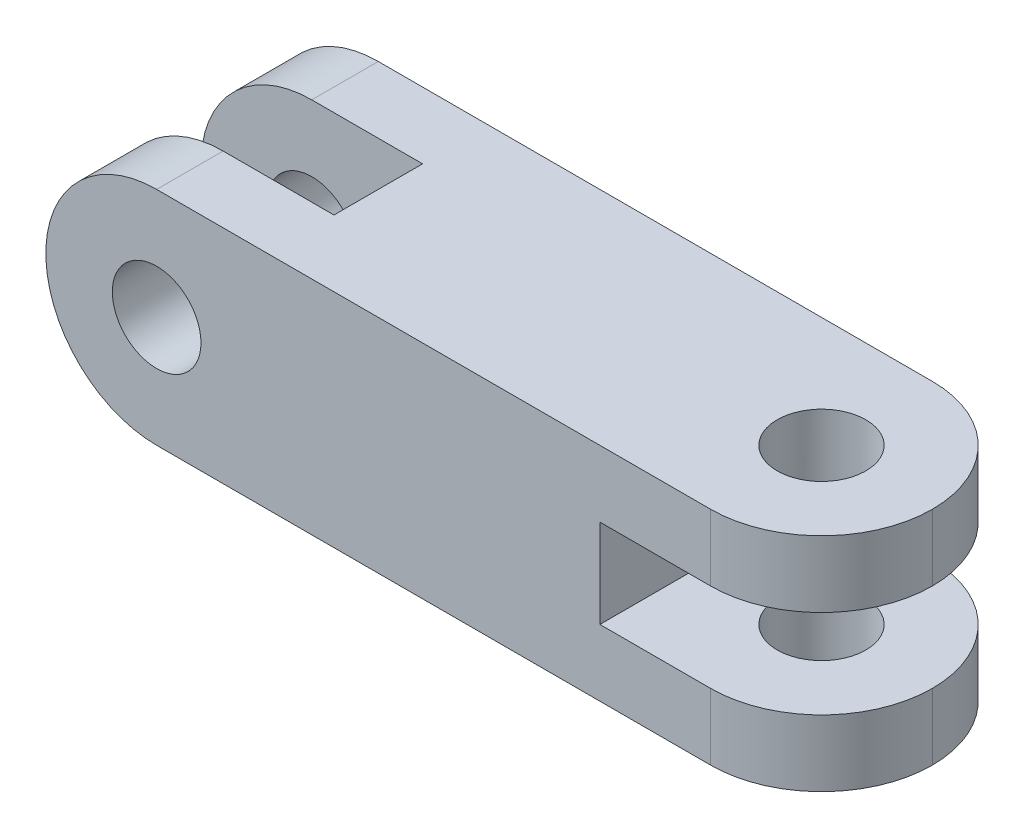
ISO-10303-21;
HEADER;
FILE_DESCRIPTION(('STEP AP214'),'2;1');
FILE_NAME('part.step','',(''),(''),'','','');
FILE_SCHEMA(('AUTOMOTIVE_DESIGN { 1 0 10303 214 1 1 1 1 }'));
ENDSEC;
DATA;
#1=APPLICATION_CONTEXT('core data for automotive mechanical design processes');
#2=APPLICATION_PROTOCOL_DEFINITION('international standard','automotive_design',2000,#1);
#3=PRODUCT_CONTEXT('',#1,'mechanical');
#4=PRODUCT('Part','Part','',(#3));
#5=PRODUCT_RELATED_PRODUCT_CATEGORY('part','',(#4));
#6=PRODUCT_DEFINITION_FORMATION('','',#4);
#7=PRODUCT_DEFINITION_CONTEXT('part definition',#1,'design');
#8=PRODUCT_DEFINITION('design','',#6,#7);
#9=PRODUCT_DEFINITION_SHAPE('','',#8);
#10=(LENGTH_UNIT() NAMED_UNIT(*) SI_UNIT(.MILLI.,.METRE.));
#11=(NAMED_UNIT(*) PLANE_ANGLE_UNIT() SI_UNIT($,.RADIAN.));
#12=(NAMED_UNIT(*) SI_UNIT($,.STERADIAN.) SOLID_ANGLE_UNIT());
#13=UNCERTAINTY_MEASURE_WITH_UNIT(LENGTH_MEASURE(1.E-05),#10,'distance_accuracy_value','');
#14=(GEOMETRIC_REPRESENTATION_CONTEXT(3) GLOBAL_UNCERTAINTY_ASSIGNED_CONTEXT((#13)) GLOBAL_UNIT_ASSIGNED_CONTEXT((#10,
#11,#12)) REPRESENTATION_CONTEXT('',''));
#15=CARTESIAN_POINT('',(0.,0.,0.));
#16=DIRECTION('',(0.,0.,1.));
#17=DIRECTION('',(1.,0.,0.));
#18=AXIS2_PLACEMENT_3D('',#15,#16,#17);
#19=CARTESIAN_POINT('',(-25.,0.,0.));
#20=DIRECTION('',(0.,-1.,0.));
#21=DIRECTION('',(0.,0.,-1.));
#22=AXIS2_PLACEMENT_3D('',#19,#20,#21);
#23=CYLINDRICAL_SURFACE('',#22,25.);
#24=CARTESIAN_POINT('',(-25.,10.0000000000173,0.));
#25=DIRECTION('',(0.,1.,0.));
#26=DIRECTION('',(0.,0.,1.));
#27=AXIS2_PLACEMENT_3D('',#24,#25,#26);
#28=CIRCLE('',#27,25.);
#29=CARTESIAN_POINT('',(0.,10.0000000000173,0.));
#30=VERTEX_POINT('',#29);
#31=CARTESIAN_POINT('',(-25.,10.0000000000173,25.));
#32=VERTEX_POINT('',#31);
#33=EDGE_CURVE('E169',#30,#32,#28,.F.);
#34=ORIENTED_EDGE('',*,*,#33,.F.);
#35=DIRECTION('',(0.,1.,0.));
#36=VECTOR('',#35,1.);
#37=CARTESIAN_POINT('',(0.,-24.9999999999827,0.));
#38=LINE('',#37,#36);
#39=CARTESIAN_POINT('',(0.,25.0000000000173,0.));
#40=VERTEX_POINT('',#39);
#41=EDGE_CURVE('E203',#40,#30,#38,.F.);
#42=ORIENTED_EDGE('',*,*,#41,.F.);
#43=CARTESIAN_POINT('',(-25.,25.0000000000173,0.));
#44=DIRECTION('',(0.,-1.,0.));
#45=DIRECTION('',(0.,0.,-1.));
#46=AXIS2_PLACEMENT_3D('',#43,#44,#45);
#47=CIRCLE('',#46,25.);
#48=CARTESIAN_POINT('',(-25.,25.0000000000173,25.));
#49=VERTEX_POINT('',#48);
#50=EDGE_CURVE('E215',#49,#40,#47,.F.);
#51=ORIENTED_EDGE('',*,*,#50,.F.);
#52=DIRECTION('',(0.,1.,0.));
#53=VECTOR('',#52,1.);
#54=CARTESIAN_POINT('',(-25.,25.0000000000173,25.));
#55=LINE('',#54,#53);
#56=EDGE_CURVE('E228',#32,#49,#55,.T.);
#57=ORIENTED_EDGE('',*,*,#56,.F.);
#58=EDGE_LOOP('',(#34,#42,#51,#57));
#59=FACE_BOUND('',#58,.T.);
#60=ADVANCED_FACE('F33',(#59),#23,.T.);
#61=CARTESIAN_POINT('',(-25.,25.0000000000173,0.));
#62=DIRECTION('',(0.,1.,0.));
#63=DIRECTION('',(0.,0.,1.));
#64=AXIS2_PLACEMENT_3D('',#61,#62,#63);
#65=CYLINDRICAL_SURFACE('',#64,25.);
#66=CARTESIAN_POINT('',(-25.,10.0000000000173,0.));
#67=DIRECTION('',(0.,1.,0.));
#68=DIRECTION('',(0.,0.,1.));
#69=AXIS2_PLACEMENT_3D('',#66,#67,#68);
#70=CIRCLE('',#69,25.);
#71=CARTESIAN_POINT('',(-25.,10.0000000000173,-25.));
#72=VERTEX_POINT('',#71);
#73=EDGE_CURVE('E11',#72,#30,#70,.F.);
#74=ORIENTED_EDGE('',*,*,#73,.F.);
#75=DIRECTION('',(0.,1.,0.));
#76=VECTOR('',#75,1.);
#77=CARTESIAN_POINT('',(-25.,0.,-25.));
#78=LINE('',#77,#76);
#79=CARTESIAN_POINT('',(-25.,25.0000000000173,-25.));
#80=VERTEX_POINT('',#79);
#81=EDGE_CURVE('E220',#80,#72,#78,.F.);
#82=ORIENTED_EDGE('',*,*,#81,.F.);
#83=CARTESIAN_POINT('',(-25.,25.0000000000173,0.));
#84=DIRECTION('',(0.,-1.,0.));
#85=DIRECTION('',(0.,0.,-1.));
#86=AXIS2_PLACEMENT_3D('',#83,#84,#85);
#87=CIRCLE('',#86,25.);
#88=EDGE_CURVE('E217',#40,#80,#87,.F.);
#89=ORIENTED_EDGE('',*,*,#88,.F.);
#90=ORIENTED_EDGE('',*,*,#41,.T.);
#91=EDGE_LOOP('',(#74,#82,#89,#90));
#92=FACE_BOUND('',#91,.T.);
#93=ADVANCED_FACE('F262',(#92),#65,.T.);
#94=CARTESIAN_POINT('',(-149.999982985447,0.,25.));
#95=DIRECTION('',(0.,0.,-1.));
#96=DIRECTION('',(-1.,0.,0.));
#97=AXIS2_PLACEMENT_3D('',#94,#95,#96);
#98=CYLINDRICAL_SURFACE('',#97,25.0000000000145);
#99=CARTESIAN_POINT('',(-149.999982985447,0.,-10.));
#100=DIRECTION('',(0.,0.,1.));
#101=DIRECTION('',(1.,0.,0.));
#102=AXIS2_PLACEMENT_3D('',#99,#100,#101);
#103=CIRCLE('',#102,25.0000000000145);
#104=CARTESIAN_POINT('',(-150.,25.0000000000173,-10.));
#105=VERTEX_POINT('',#104);
#106=CARTESIAN_POINT('',(-149.999982985447,-24.9999999999827,-10.));
#107=VERTEX_POINT('',#106);
#108=EDGE_CURVE('E187',#105,#107,#103,.T.);
#109=ORIENTED_EDGE('',*,*,#108,.F.);
#110=DIRECTION('',(0.,0.,-1.));
#111=VECTOR('',#110,1.);
#112=CARTESIAN_POINT('',(-150.,25.0000000000173,25.));
#113=LINE('',#112,#111);
#114=CARTESIAN_POINT('',(-150.,25.0000000000173,-25.));
#115=VERTEX_POINT('',#114);
#116=EDGE_CURVE('E198',#105,#115,#113,.T.);
#117=ORIENTED_EDGE('',*,*,#116,.T.);
#118=CARTESIAN_POINT('',(-149.999982985447,0.,-25.));
#119=DIRECTION('',(0.,0.,1.));
#120=DIRECTION('',(1.,0.,0.));
#121=AXIS2_PLACEMENT_3D('',#118,#119,#120);
#122=CIRCLE('',#121,25.0000000000145);
#123=CARTESIAN_POINT('',(-149.999982985447,-25.0000000000058,-25.));
#124=VERTEX_POINT('',#123);
#125=EDGE_CURVE('E199',#115,#124,#122,.T.);
#126=ORIENTED_EDGE('',*,*,#125,.T.);
#127=DIRECTION('',(0.,0.,-1.));
#128=VECTOR('',#127,1.);
#129=CARTESIAN_POINT('',(-149.999982985447,-25.0000000000058,25.));
#130=LINE('',#129,#128);
#131=EDGE_CURVE('E211',#107,#124,#130,.T.);
#132=ORIENTED_EDGE('',*,*,#131,.F.);
#133=EDGE_LOOP('',(#109,#117,#126,#132));
#134=FACE_BOUND('',#133,.T.);
#135=ADVANCED_FACE('F253',(#134),#98,.T.);
#136=CARTESIAN_POINT('',(-149.999982985447,-25.0000000000058,25.));
#137=DIRECTION('',(-1.54228499331704E-13,1.,0.));
#138=DIRECTION('',(-1.,-1.54228499331704E-13,0.));
#139=AXIS2_PLACEMENT_3D('',#136,#137,#138);
#140=PLANE('',#139);
#141=CARTESIAN_POINT('',(-25.,-24.9999999999865,0.));
#142=DIRECTION('',(0.,-1.,0.));
#143=DIRECTION('',(0.,0.,-1.));
#144=AXIS2_PLACEMENT_3D('',#141,#142,#143);
#145=CIRCLE('',#144,9.99999999999999);
#146=CARTESIAN_POINT('',(-25.,-24.9999999999865,-9.99999999999999));
#147=VERTEX_POINT('',#146);
#148=EDGE_CURVE('E352',#147,#147,#145,.T.);
#149=ORIENTED_EDGE('',*,*,#148,.F.);
#150=EDGE_LOOP('',(#149));
#151=FACE_BOUND('',#150,.T.);
#152=DIRECTION('',(1.,0.,0.));
#153=VECTOR('',#152,1.);
#154=CARTESIAN_POINT('',(-186.25892155751,-24.9999999999827,-10.));
#155=LINE('',#154,#153);
#156=CARTESIAN_POINT('',(-124.999982985462,-24.9999999999827,-10.));
#157=VERTEX_POINT('',#156);
#158=EDGE_CURVE('E177',#107,#157,#155,.T.);
#159=ORIENTED_EDGE('',*,*,#158,.F.);
#160=ORIENTED_EDGE('',*,*,#131,.T.);
#161=DIRECTION('',(1.,1.54228499331704E-13,0.));
#162=VECTOR('',#161,1.);
#163=CARTESIAN_POINT('',(-149.999982985447,-25.0000000000058,-25.));
#164=LINE('',#163,#162);
#165=CARTESIAN_POINT('',(-25.,-24.9999999999865,-25.));
#166=VERTEX_POINT('',#165);
#167=EDGE_CURVE('E202',#124,#166,#164,.T.);
#168=ORIENTED_EDGE('',*,*,#167,.T.);
#169=CARTESIAN_POINT('',(-25.,-24.9999999999865,0.));
#170=DIRECTION('',(-1.54228499331704E-13,1.,0.));
#171=DIRECTION('',(-1.,-1.54228499331704E-13,0.));
#172=AXIS2_PLACEMENT_3D('',#169,#170,#171);
#173=CIRCLE('',#172,25.);
#174=CARTESIAN_POINT('',(0.,-24.9999999999827,0.));
#175=VERTEX_POINT('',#174);
#176=EDGE_CURVE('E225',#166,#175,#173,.F.);
#177=ORIENTED_EDGE('',*,*,#176,.T.);
#178=CARTESIAN_POINT('',(-25.,-24.9999999999865,0.));
#179=DIRECTION('',(-1.54228499331704E-13,1.,0.));
#180=DIRECTION('',(-1.,-1.54228499331704E-13,0.));
#181=AXIS2_PLACEMENT_3D('',#178,#179,#180);
#182=CIRCLE('',#181,25.);
#183=CARTESIAN_POINT('',(-25.,-24.9999999999865,25.));
#184=VERTEX_POINT('',#183);
#185=EDGE_CURVE('E223',#175,#184,#182,.F.);
#186=ORIENTED_EDGE('',*,*,#185,.T.);
#187=DIRECTION('',(1.,1.54228499331704E-13,0.));
#188=VECTOR('',#187,1.);
#189=CARTESIAN_POINT('',(-149.999982985447,-25.0000000000058,25.));
#190=LINE('',#189,#188);
#191=CARTESIAN_POINT('',(-149.999982985447,-25.0000000000058,25.));
#192=VERTEX_POINT('',#191);
#193=EDGE_CURVE('E193',#192,#184,#190,.T.);
#194=ORIENTED_EDGE('',*,*,#193,.F.);
#195=CARTESIAN_POINT('',(-149.999982985447,-24.9999999999827,10.));
#196=VERTEX_POINT('',#195);
#197=EDGE_CURVE('E212',#192,#196,#130,.T.);
#198=ORIENTED_EDGE('',*,*,#197,.T.);
#199=DIRECTION('',(1.,0.,0.));
#200=VECTOR('',#199,1.);
#201=CARTESIAN_POINT('',(-186.25892155751,-24.9999999999827,10.));
#202=LINE('',#201,#200);
#203=CARTESIAN_POINT('',(-124.999982985462,-24.9999999999827,10.));
#204=VERTEX_POINT('',#203);
#205=EDGE_CURVE('E172',#196,#204,#202,.T.);
#206=ORIENTED_EDGE('',*,*,#205,.T.);
#207=DIRECTION('',(0.,0.,1.));
#208=VECTOR('',#207,1.);
#209=CARTESIAN_POINT('',(-124.999982985462,-24.9999999999827,-10.));
#210=LINE('',#209,#208);
#211=EDGE_CURVE('E175',#157,#204,#210,.T.);
#212=ORIENTED_EDGE('',*,*,#211,.F.);
#213=EDGE_LOOP('',(#159,#160,#168,#177,#186,#194,#198,#206,#212));
#214=FACE_BOUND('',#213,.T.);
#215=ADVANCED_FACE('F247',(#151,#214),#140,.F.);
#216=CARTESIAN_POINT('',(-150.,25.0000000000173,25.));
#217=DIRECTION('',(0.,-1.,0.));
#218=DIRECTION('',(0.,0.,-1.));
#219=AXIS2_PLACEMENT_3D('',#216,#217,#218);
#220=PLANE('',#219);
#221=CARTESIAN_POINT('',(-25.,25.0000000000405,0.));
#222=DIRECTION('',(0.,-1.,0.));
#223=DIRECTION('',(0.,0.,-1.));
#224=AXIS2_PLACEMENT_3D('',#221,#222,#223);
#225=CIRCLE('',#224,9.99999999999999);
#226=CARTESIAN_POINT('',(-25.,25.0000000000405,-9.99999999999999));
#227=VERTEX_POINT('',#226);
#228=EDGE_CURVE('E355',#227,#227,#225,.T.);
#229=ORIENTED_EDGE('',*,*,#228,.T.);
#230=EDGE_LOOP('',(#229));
#231=FACE_BOUND('',#230,.T.);
#232=DIRECTION('',(-1.,0.,0.));
#233=VECTOR('',#232,1.);
#234=CARTESIAN_POINT('',(-150.,25.0000000000173,-10.));
#235=LINE('',#234,#233);
#236=CARTESIAN_POINT('',(-124.999982985462,25.0000000000173,-10.));
#237=VERTEX_POINT('',#236);
#238=EDGE_CURVE('E234',#237,#105,#235,.T.);
#239=ORIENTED_EDGE('',*,*,#238,.F.);
#240=DIRECTION('',(0.,0.,1.));
#241=VECTOR('',#240,1.);
#242=CARTESIAN_POINT('',(-124.999982985462,25.0000000000173,-10.));
#243=LINE('',#242,#241);
#244=CARTESIAN_POINT('',(-124.999982985462,25.0000000000173,10.));
#245=VERTEX_POINT('',#244);
#246=EDGE_CURVE('E171',#237,#245,#243,.T.);
#247=ORIENTED_EDGE('',*,*,#246,.T.);
#248=DIRECTION('',(-1.,0.,0.));
#249=VECTOR('',#248,1.);
#250=CARTESIAN_POINT('',(-150.,25.0000000000173,10.));
#251=LINE('',#250,#249);
#252=CARTESIAN_POINT('',(-150.,25.0000000000173,10.));
#253=VERTEX_POINT('',#252);
#254=EDGE_CURVE('E230',#245,#253,#251,.T.);
#255=ORIENTED_EDGE('',*,*,#254,.T.);
#256=CARTESIAN_POINT('',(-150.,25.0000000000173,25.));
#257=VERTEX_POINT('',#256);
#258=EDGE_CURVE('E208',#257,#253,#113,.T.);
#259=ORIENTED_EDGE('',*,*,#258,.F.);
#260=DIRECTION('',(-1.,0.,0.));
#261=VECTOR('',#260,1.);
#262=CARTESIAN_POINT('',(-150.,25.0000000000173,25.));
#263=LINE('',#262,#261);
#264=EDGE_CURVE('E196',#49,#257,#263,.T.);
#265=ORIENTED_EDGE('',*,*,#264,.F.);
#266=ORIENTED_EDGE('',*,*,#50,.T.);
#267=ORIENTED_EDGE('',*,*,#88,.T.);
#268=DIRECTION('',(-1.,0.,0.));
#269=VECTOR('',#268,1.);
#270=CARTESIAN_POINT('',(-150.,25.0000000000173,-25.));
#271=LINE('',#270,#269);
#272=EDGE_CURVE('E194',#80,#115,#271,.T.);
#273=ORIENTED_EDGE('',*,*,#272,.T.);
#274=ORIENTED_EDGE('',*,*,#116,.F.);
#275=EDGE_LOOP('',(#239,#247,#255,#259,#265,#266,#267,#273,#274));
#276=FACE_BOUND('',#275,.T.);
#277=ADVANCED_FACE('F257',(#231,#276),#220,.F.);
#278=ORIENTED_EDGE('',*,*,#258,.T.);
#279=CARTESIAN_POINT('',(-149.999982985447,0.,10.));
#280=DIRECTION('',(0.,0.,1.));
#281=DIRECTION('',(1.,0.,0.));
#282=AXIS2_PLACEMENT_3D('',#279,#280,#281);
#283=CIRCLE('',#282,25.0000000000145);
#284=EDGE_CURVE('E56',#253,#196,#283,.T.);
#285=ORIENTED_EDGE('',*,*,#284,.T.);
#286=ORIENTED_EDGE('',*,*,#197,.F.);
#287=CARTESIAN_POINT('',(-149.999982985447,0.,25.));
#288=DIRECTION('',(0.,0.,1.));
#289=DIRECTION('',(1.,0.,0.));
#290=AXIS2_PLACEMENT_3D('',#287,#288,#289);
#291=CIRCLE('',#290,25.0000000000145);
#292=EDGE_CURVE('E190',#257,#192,#291,.T.);
#293=ORIENTED_EDGE('',*,*,#292,.F.);
#294=EDGE_LOOP('',(#278,#285,#286,#293));
#295=FACE_BOUND('',#294,.T.);
#296=ADVANCED_FACE('F275',(#295),#98,.T.);
#297=CARTESIAN_POINT('',(-149.999982985447,0.,25.));
#298=DIRECTION('',(0.,0.,1.));
#299=DIRECTION('',(1.,0.,0.));
#300=AXIS2_PLACEMENT_3D('',#297,#298,#299);
#301=PLANE('',#300);
#302=CARTESIAN_POINT('',(-149.999982985447,0.,25.));
#303=DIRECTION('',(0.,0.,1.));
#304=DIRECTION('',(1.,0.,0.));
#305=AXIS2_PLACEMENT_3D('',#302,#303,#304);
#306=CIRCLE('',#305,9.99999999999998);
#307=CARTESIAN_POINT('',(-139.999982985447,0.,25.));
#308=VERTEX_POINT('',#307);
#309=EDGE_CURVE('E344',#308,#308,#306,.T.);
#310=ORIENTED_EDGE('',*,*,#309,.F.);
#311=EDGE_LOOP('',(#310));
#312=FACE_BOUND('',#311,.T.);
#313=DIRECTION('',(1.,0.,0.));
#314=VECTOR('',#313,1.);
#315=CARTESIAN_POINT('',(11.0748501920987,10.0000000000173,25.));
#316=LINE('',#315,#314);
#317=CARTESIAN_POINT('',(-50.,10.0000000000173,25.));
#318=VERTEX_POINT('',#317);
#319=EDGE_CURVE('E142',#318,#32,#316,.T.);
#320=ORIENTED_EDGE('',*,*,#319,.T.);
#321=ORIENTED_EDGE('',*,*,#56,.T.);
#322=ORIENTED_EDGE('',*,*,#264,.T.);
#323=ORIENTED_EDGE('',*,*,#292,.T.);
#324=ORIENTED_EDGE('',*,*,#193,.T.);
#325=CARTESIAN_POINT('',(-25.,-9.99999999998266,25.));
#326=VERTEX_POINT('',#325);
#327=EDGE_CURVE('E155',#184,#326,#55,.T.);
#328=ORIENTED_EDGE('',*,*,#327,.T.);
#329=DIRECTION('',(-1.,0.,0.));
#330=VECTOR('',#329,1.);
#331=CARTESIAN_POINT('',(11.0748501920987,-9.99999999998266,25.));
#332=LINE('',#331,#330);
#333=CARTESIAN_POINT('',(-50.,-9.99999999998266,25.));
#334=VERTEX_POINT('',#333);
#335=EDGE_CURVE('E135',#326,#334,#332,.T.);
#336=ORIENTED_EDGE('',*,*,#335,.T.);
#337=DIRECTION('',(0.,1.,0.));
#338=VECTOR('',#337,1.);
#339=CARTESIAN_POINT('',(-50.,10.0000000000173,25.));
#340=LINE('',#339,#338);
#341=EDGE_CURVE('E145',#334,#318,#340,.T.);
#342=ORIENTED_EDGE('',*,*,#341,.T.);
#343=EDGE_LOOP('',(#320,#321,#322,#323,#324,#328,#336,#342));
#344=FACE_BOUND('',#343,.T.);
#345=ADVANCED_FACE('F152',(#312,#344),#301,.T.);
#346=CARTESIAN_POINT('',(-149.999982985447,0.,-25.));
#347=DIRECTION('',(0.,0.,1.));
#348=DIRECTION('',(1.,0.,0.));
#349=AXIS2_PLACEMENT_3D('',#346,#347,#348);
#350=PLANE('',#349);
#351=CARTESIAN_POINT('',(-149.999982985447,0.,-25.));
#352=DIRECTION('',(0.,0.,1.));
#353=DIRECTION('',(1.,0.,0.));
#354=AXIS2_PLACEMENT_3D('',#351,#352,#353);
#355=CIRCLE('',#354,9.99999999999998);
#356=CARTESIAN_POINT('',(-139.999982985447,0.,-25.));
#357=VERTEX_POINT('',#356);
#358=EDGE_CURVE('E342',#357,#357,#355,.T.);
#359=ORIENTED_EDGE('',*,*,#358,.T.);
#360=EDGE_LOOP('',(#359));
#361=FACE_BOUND('',#360,.T.);
#362=ORIENTED_EDGE('',*,*,#81,.T.);
#363=DIRECTION('',(1.,0.,0.));
#364=VECTOR('',#363,1.);
#365=CARTESIAN_POINT('',(11.0748501920987,10.0000000000173,-25.));
#366=LINE('',#365,#364);
#367=CARTESIAN_POINT('',(-50.,10.0000000000173,-25.));
#368=VERTEX_POINT('',#367);
#369=EDGE_CURVE('E156',#368,#72,#366,.T.);
#370=ORIENTED_EDGE('',*,*,#369,.F.);
#371=DIRECTION('',(0.,1.,0.));
#372=VECTOR('',#371,1.);
#373=CARTESIAN_POINT('',(-50.,10.0000000000173,-25.));
#374=LINE('',#373,#372);
#375=CARTESIAN_POINT('',(-50.,-9.99999999998266,-25.));
#376=VERTEX_POINT('',#375);
#377=EDGE_CURVE('E158',#376,#368,#374,.T.);
#378=ORIENTED_EDGE('',*,*,#377,.F.);
#379=DIRECTION('',(-1.,0.,0.));
#380=VECTOR('',#379,1.);
#381=CARTESIAN_POINT('',(11.0748501920987,-9.99999999998266,-25.));
#382=LINE('',#381,#380);
#383=CARTESIAN_POINT('',(-25.,-9.99999999998266,-25.));
#384=VERTEX_POINT('',#383);
#385=EDGE_CURVE('E137',#384,#376,#382,.T.);
#386=ORIENTED_EDGE('',*,*,#385,.F.);
#387=EDGE_CURVE('E219',#384,#166,#78,.F.);
#388=ORIENTED_EDGE('',*,*,#387,.T.);
#389=ORIENTED_EDGE('',*,*,#167,.F.);
#390=ORIENTED_EDGE('',*,*,#125,.F.);
#391=ORIENTED_EDGE('',*,*,#272,.F.);
#392=EDGE_LOOP('',(#362,#370,#378,#386,#388,#389,#390,#391));
#393=FACE_BOUND('',#392,.T.);
#394=ADVANCED_FACE('F239',(#361,#393),#350,.F.);
#395=CARTESIAN_POINT('',(-25.,-9.99999999998266,0.));
#396=DIRECTION('',(0.,-1.,0.));
#397=DIRECTION('',(0.,0.,-1.));
#398=AXIS2_PLACEMENT_3D('',#395,#396,#397);
#399=CIRCLE('',#398,25.);
#400=CARTESIAN_POINT('',(0.,-9.99999999998266,0.));
#401=VERTEX_POINT('',#400);
#402=EDGE_CURVE('E48',#326,#401,#399,.F.);
#403=ORIENTED_EDGE('',*,*,#402,.F.);
#404=ORIENTED_EDGE('',*,*,#327,.F.);
#405=ORIENTED_EDGE('',*,*,#185,.F.);
#406=EDGE_CURVE('E189',#401,#175,#38,.F.);
#407=ORIENTED_EDGE('',*,*,#406,.F.);
#408=EDGE_LOOP('',(#403,#404,#405,#407));
#409=FACE_BOUND('',#408,.T.);
#410=ADVANCED_FACE('F35',(#409),#23,.T.);
#411=CARTESIAN_POINT('',(-25.,-9.99999999998266,0.));
#412=DIRECTION('',(0.,-1.,0.));
#413=DIRECTION('',(0.,0.,-1.));
#414=AXIS2_PLACEMENT_3D('',#411,#412,#413);
#415=CIRCLE('',#414,25.);
#416=EDGE_CURVE('E41',#401,#384,#415,.F.);
#417=ORIENTED_EDGE('',*,*,#416,.F.);
#418=ORIENTED_EDGE('',*,*,#406,.T.);
#419=ORIENTED_EDGE('',*,*,#176,.F.);
#420=ORIENTED_EDGE('',*,*,#387,.F.);
#421=EDGE_LOOP('',(#417,#418,#419,#420));
#422=FACE_BOUND('',#421,.T.);
#423=ADVANCED_FACE('F243',(#422),#65,.T.);
#424=CARTESIAN_POINT('',(-186.25892155751,-24.9999999999827,-10.));
#425=DIRECTION('',(0.,0.,1.));
#426=DIRECTION('',(1.,0.,0.));
#427=AXIS2_PLACEMENT_3D('',#424,#425,#426);
#428=PLANE('',#427);
#429=CARTESIAN_POINT('',(-149.999982985447,0.,-10.));
#430=DIRECTION('',(0.,0.,1.));
#431=DIRECTION('',(1.,0.,0.));
#432=AXIS2_PLACEMENT_3D('',#429,#430,#431);
#433=CIRCLE('',#432,9.99999999999998);
#434=CARTESIAN_POINT('',(-139.999982985447,0.,-10.));
#435=VERTEX_POINT('',#434);
#436=EDGE_CURVE('E339',#435,#435,#433,.T.);
#437=ORIENTED_EDGE('',*,*,#436,.F.);
#438=EDGE_LOOP('',(#437));
#439=FACE_BOUND('',#438,.T.);
#440=ORIENTED_EDGE('',*,*,#108,.T.);
#441=ORIENTED_EDGE('',*,*,#158,.T.);
#442=DIRECTION('',(0.,1.,0.));
#443=VECTOR('',#442,1.);
#444=CARTESIAN_POINT('',(-124.999982985462,-24.9999999999827,-10.));
#445=LINE('',#444,#443);
#446=EDGE_CURVE('E182',#157,#237,#445,.T.);
#447=ORIENTED_EDGE('',*,*,#446,.T.);
#448=ORIENTED_EDGE('',*,*,#238,.T.);
#449=EDGE_LOOP('',(#440,#441,#447,#448));
#450=FACE_BOUND('',#449,.T.);
#451=ADVANCED_FACE('F282',(#439,#450),#428,.T.);
#452=CARTESIAN_POINT('',(-186.25892155751,-24.9999999999827,10.));
#453=DIRECTION('',(0.,0.,1.));
#454=DIRECTION('',(1.,0.,0.));
#455=AXIS2_PLACEMENT_3D('',#452,#453,#454);
#456=PLANE('',#455);
#457=CARTESIAN_POINT('',(-149.999982985447,0.,10.));
#458=DIRECTION('',(0.,0.,1.));
#459=DIRECTION('',(1.,0.,0.));
#460=AXIS2_PLACEMENT_3D('',#457,#458,#459);
#461=CIRCLE('',#460,9.99999999999998);
#462=CARTESIAN_POINT('',(-139.999982985447,0.,10.));
#463=VERTEX_POINT('',#462);
#464=EDGE_CURVE('E343',#463,#463,#461,.T.);
#465=ORIENTED_EDGE('',*,*,#464,.T.);
#466=EDGE_LOOP('',(#465));
#467=FACE_BOUND('',#466,.T.);
#468=ORIENTED_EDGE('',*,*,#254,.F.);
#469=DIRECTION('',(0.,1.,0.));
#470=VECTOR('',#469,1.);
#471=CARTESIAN_POINT('',(-124.999982985462,-24.9999999999827,10.));
#472=LINE('',#471,#470);
#473=EDGE_CURVE('E179',#204,#245,#472,.T.);
#474=ORIENTED_EDGE('',*,*,#473,.F.);
#475=ORIENTED_EDGE('',*,*,#205,.F.);
#476=ORIENTED_EDGE('',*,*,#284,.F.);
#477=EDGE_LOOP('',(#468,#474,#475,#476));
#478=FACE_BOUND('',#477,.T.);
#479=ADVANCED_FACE('F304',(#467,#478),#456,.F.);
#480=CARTESIAN_POINT('',(-124.999982985462,-24.9999999999827,-10.));
#481=DIRECTION('',(-1.,0.,0.));
#482=DIRECTION('',(0.,0.,1.));
#483=AXIS2_PLACEMENT_3D('',#480,#481,#482);
#484=PLANE('',#483);
#485=ORIENTED_EDGE('',*,*,#246,.F.);
#486=ORIENTED_EDGE('',*,*,#446,.F.);
#487=ORIENTED_EDGE('',*,*,#211,.T.);
#488=ORIENTED_EDGE('',*,*,#473,.T.);
#489=EDGE_LOOP('',(#485,#486,#487,#488));
#490=FACE_BOUND('',#489,.T.);
#491=ADVANCED_FACE('F307',(#490),#484,.T.);
#492=CARTESIAN_POINT('',(11.0748501920987,10.0000000000173,25.));
#493=DIRECTION('',(0.,1.,0.));
#494=DIRECTION('',(0.,0.,1.));
#495=AXIS2_PLACEMENT_3D('',#492,#493,#494);
#496=PLANE('',#495);
#497=CARTESIAN_POINT('',(-25.,10.0000000000173,0.));
#498=DIRECTION('',(0.,1.,0.));
#499=DIRECTION('',(0.,0.,1.));
#500=AXIS2_PLACEMENT_3D('',#497,#498,#499);
#501=CIRCLE('',#500,9.99999999999999);
#502=CARTESIAN_POINT('',(-25.,10.0000000000173,9.99999999999999));
#503=VERTEX_POINT('',#502);
#504=EDGE_CURVE('E357',#503,#503,#501,.T.);
#505=ORIENTED_EDGE('',*,*,#504,.T.);
#506=EDGE_LOOP('',(#505));
#507=FACE_BOUND('',#506,.T.);
#508=ORIENTED_EDGE('',*,*,#33,.T.);
#509=ORIENTED_EDGE('',*,*,#319,.F.);
#510=DIRECTION('',(0.,0.,-1.));
#511=VECTOR('',#510,1.);
#512=CARTESIAN_POINT('',(-50.,10.0000000000173,25.));
#513=LINE('',#512,#511);
#514=EDGE_CURVE('E141',#318,#368,#513,.T.);
#515=ORIENTED_EDGE('',*,*,#514,.T.);
#516=ORIENTED_EDGE('',*,*,#369,.T.);
#517=ORIENTED_EDGE('',*,*,#73,.T.);
#518=EDGE_LOOP('',(#508,#509,#515,#516,#517));
#519=FACE_BOUND('',#518,.T.);
#520=ADVANCED_FACE('F266',(#507,#519),#496,.F.);
#521=CARTESIAN_POINT('',(-50.,10.0000000000173,25.));
#522=DIRECTION('',(-1.,0.,0.));
#523=DIRECTION('',(0.,0.,1.));
#524=AXIS2_PLACEMENT_3D('',#521,#522,#523);
#525=PLANE('',#524);
#526=ORIENTED_EDGE('',*,*,#377,.T.);
#527=ORIENTED_EDGE('',*,*,#514,.F.);
#528=ORIENTED_EDGE('',*,*,#341,.F.);
#529=DIRECTION('',(0.,0.,-1.));
#530=VECTOR('',#529,1.);
#531=CARTESIAN_POINT('',(-50.,-9.99999999998266,25.));
#532=LINE('',#531,#530);
#533=EDGE_CURVE('E131',#334,#376,#532,.T.);
#534=ORIENTED_EDGE('',*,*,#533,.T.);
#535=EDGE_LOOP('',(#526,#527,#528,#534));
#536=FACE_BOUND('',#535,.T.);
#537=ADVANCED_FACE('F146',(#536),#525,.F.);
#538=CARTESIAN_POINT('',(11.0748501920987,-9.99999999998266,25.));
#539=DIRECTION('',(0.,-1.,0.));
#540=DIRECTION('',(0.,0.,-1.));
#541=AXIS2_PLACEMENT_3D('',#538,#539,#540);
#542=PLANE('',#541);
#543=CARTESIAN_POINT('',(-25.,-9.99999999998266,0.));
#544=DIRECTION('',(0.,-1.,0.));
#545=DIRECTION('',(0.,0.,-1.));
#546=AXIS2_PLACEMENT_3D('',#543,#544,#545);
#547=CIRCLE('',#546,9.99999999999999);
#548=CARTESIAN_POINT('',(-25.,-9.99999999998266,-9.99999999999999));
#549=VERTEX_POINT('',#548);
#550=EDGE_CURVE('E161',#549,#549,#547,.T.);
#551=ORIENTED_EDGE('',*,*,#550,.T.);
#552=EDGE_LOOP('',(#551));
#553=FACE_BOUND('',#552,.T.);
#554=ORIENTED_EDGE('',*,*,#402,.T.);
#555=ORIENTED_EDGE('',*,*,#416,.T.);
#556=ORIENTED_EDGE('',*,*,#385,.T.);
#557=ORIENTED_EDGE('',*,*,#533,.F.);
#558=ORIENTED_EDGE('',*,*,#335,.F.);
#559=EDGE_LOOP('',(#554,#555,#556,#557,#558));
#560=FACE_BOUND('',#559,.T.);
#561=ADVANCED_FACE('F133',(#553,#560),#542,.F.);
#562=CARTESIAN_POINT('',(-25.,-24.9999999999865,0.));
#563=DIRECTION('',(0.,-1.,0.));
#564=DIRECTION('',(0.,0.,-1.));
#565=AXIS2_PLACEMENT_3D('',#562,#563,#564);
#566=CYLINDRICAL_SURFACE('',#565,9.99999999999999);
#567=ORIENTED_EDGE('',*,*,#148,.T.);
#568=EDGE_LOOP('',(#567));
#569=FACE_BOUND('',#568,.T.);
#570=ORIENTED_EDGE('',*,*,#550,.F.);
#571=EDGE_LOOP('',(#570));
#572=FACE_BOUND('',#571,.T.);
#573=ADVANCED_FACE('F317',(#569,#572),#566,.F.);
#574=ORIENTED_EDGE('',*,*,#228,.F.);
#575=EDGE_LOOP('',(#574));
#576=FACE_BOUND('',#575,.T.);
#577=ORIENTED_EDGE('',*,*,#504,.F.);
#578=EDGE_LOOP('',(#577));
#579=FACE_BOUND('',#578,.T.);
#580=ADVANCED_FACE('F326',(#576,#579),#566,.F.);
#581=CARTESIAN_POINT('',(-149.999982985447,0.,25.));
#582=DIRECTION('',(0.,0.,1.));
#583=DIRECTION('',(1.,0.,0.));
#584=AXIS2_PLACEMENT_3D('',#581,#582,#583);
#585=CYLINDRICAL_SURFACE('',#584,9.99999999999998);
#586=ORIENTED_EDGE('',*,*,#309,.T.);
#587=EDGE_LOOP('',(#586));
#588=FACE_BOUND('',#587,.T.);
#589=ORIENTED_EDGE('',*,*,#464,.F.);
#590=EDGE_LOOP('',(#589));
#591=FACE_BOUND('',#590,.T.);
#592=ADVANCED_FACE('F330',(#588,#591),#585,.F.);
#593=ORIENTED_EDGE('',*,*,#436,.T.);
#594=EDGE_LOOP('',(#593));
#595=FACE_BOUND('',#594,.T.);
#596=ORIENTED_EDGE('',*,*,#358,.F.);
#597=EDGE_LOOP('',(#596));
#598=FACE_BOUND('',#597,.T.);
#599=ADVANCED_FACE('F328',(#595,#598),#585,.F.);
#600=CLOSED_SHELL('',(#60,#93,#135,#215,#277,#296,#345,#394,#410,#423,#451,#479,#491,#520,#537,
#561,#573,#580,#592,#599));
#601=MANIFOLD_SOLID_BREP('B2',#600);
#602=ADVANCED_BREP_SHAPE_REPRESENTATION('',(#18,#601),#14);
#603=SHAPE_DEFINITION_REPRESENTATION(#9,#602);
ENDSEC;
END-ISO-10303-21;
